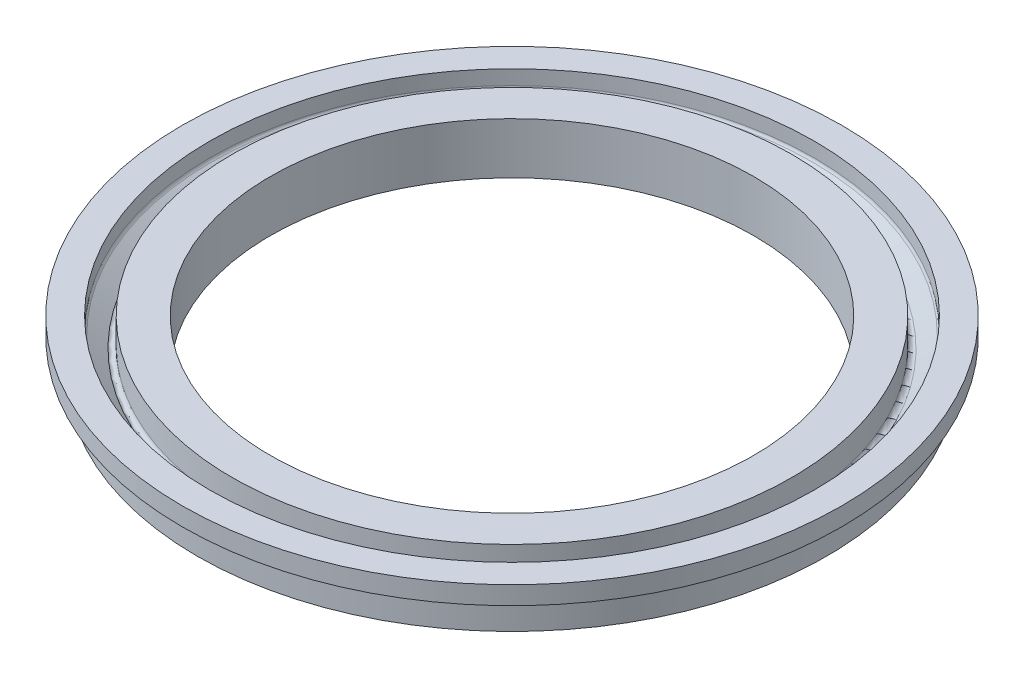
ISO-10303-21;
HEADER;
FILE_DESCRIPTION(('STEP AP214'),'2;1');
FILE_NAME('part.step','',(''),(''),'','','');
FILE_SCHEMA(('AUTOMOTIVE_DESIGN { 1 0 10303 214 1 1 1 1 }'));
ENDSEC;
DATA;
#1=APPLICATION_CONTEXT('core data for automotive mechanical design processes');
#2=APPLICATION_PROTOCOL_DEFINITION('international standard','automotive_design',2000,#1);
#3=PRODUCT_CONTEXT('',#1,'mechanical');
#4=PRODUCT('Part','Part','',(#3));
#5=PRODUCT_RELATED_PRODUCT_CATEGORY('part','',(#4));
#6=PRODUCT_DEFINITION_FORMATION('','',#4);
#7=PRODUCT_DEFINITION_CONTEXT('part definition',#1,'design');
#8=PRODUCT_DEFINITION('design','',#6,#7);
#9=PRODUCT_DEFINITION_SHAPE('','',#8);
#10=(LENGTH_UNIT() NAMED_UNIT(*) SI_UNIT(.MILLI.,.METRE.));
#11=(NAMED_UNIT(*) PLANE_ANGLE_UNIT() SI_UNIT($,.RADIAN.));
#12=(NAMED_UNIT(*) SI_UNIT($,.STERADIAN.) SOLID_ANGLE_UNIT());
#13=UNCERTAINTY_MEASURE_WITH_UNIT(LENGTH_MEASURE(1.E-05),#10,'distance_accuracy_value','');
#14=(GEOMETRIC_REPRESENTATION_CONTEXT(3) GLOBAL_UNCERTAINTY_ASSIGNED_CONTEXT((#13)) GLOBAL_UNIT_ASSIGNED_CONTEXT((#10,
#11,#12)) REPRESENTATION_CONTEXT('',''));
#15=CARTESIAN_POINT('',(0.,0.,0.));
#16=DIRECTION('',(0.,0.,1.));
#17=DIRECTION('',(1.,0.,0.));
#18=AXIS2_PLACEMENT_3D('',#15,#16,#17);
#19=CARTESIAN_POINT('',(0.,2.32755410959543,0.));
#20=DIRECTION('',(0.,1.,0.));
#21=DIRECTION('',(0.,0.,1.));
#22=AXIS2_PLACEMENT_3D('',#19,#20,#21);
#23=CONICAL_SURFACE('',#22,22.5091155851312,1.16820783945838);
#24=CARTESIAN_POINT('',(0.,1.95870686744885,0.));
#25=DIRECTION('',(0.,1.,0.));
#26=DIRECTION('',(0.,0.,1.));
#27=AXIS2_PLACEMENT_3D('',#24,#25,#26);
#28=CIRCLE('',#27,21.6429674493791);
#29=CARTESIAN_POINT('',(0.,1.95870686744885,21.6429674493791));
#30=VERTEX_POINT('',#29);
#31=EDGE_CURVE('E48',#30,#30,#28,.T.);
#32=ORIENTED_EDGE('',*,*,#31,.T.);
#33=EDGE_LOOP('',(#32));
#34=FACE_BOUND('',#33,.T.);
#35=CARTESIAN_POINT('',(0.,2.32755410959543,0.));
#36=DIRECTION('',(0.,-1.,0.));
#37=DIRECTION('',(0.,0.,-1.));
#38=AXIS2_PLACEMENT_3D('',#35,#36,#37);
#39=CIRCLE('',#38,22.5091155851312);
#40=CARTESIAN_POINT('',(0.,2.32755410959543,-22.5091155851312));
#41=VERTEX_POINT('',#40);
#42=EDGE_CURVE('E67',#41,#41,#39,.T.);
#43=ORIENTED_EDGE('',*,*,#42,.T.);
#44=EDGE_LOOP('',(#43));
#45=FACE_BOUND('',#44,.T.);
#46=ADVANCED_FACE('F41',(#34,#45),#23,.T.);
#47=CARTESIAN_POINT('',(0.,-2.52963758357563,0.));
#48=DIRECTION('',(0.,-1.,0.));
#49=DIRECTION('',(0.,0.,-1.));
#50=AXIS2_PLACEMENT_3D('',#47,#48,#49);
#51=CYLINDRICAL_SURFACE('',#50,22.5091155851312);
#52=ORIENTED_EDGE('',*,*,#42,.F.);
#53=EDGE_LOOP('',(#52));
#54=FACE_BOUND('',#53,.T.);
#55=CARTESIAN_POINT('',(0.,3.56865088334981,0.));
#56=DIRECTION('',(0.,-1.,0.));
#57=DIRECTION('',(0.,0.,-1.));
#58=AXIS2_PLACEMENT_3D('',#55,#56,#57);
#59=CIRCLE('',#58,22.5091155851312);
#60=CARTESIAN_POINT('',(0.,3.56865088334981,-22.5091155851312));
#61=VERTEX_POINT('',#60);
#62=EDGE_CURVE('E70',#61,#61,#59,.T.);
#63=ORIENTED_EDGE('',*,*,#62,.T.);
#64=EDGE_LOOP('',(#63));
#65=FACE_BOUND('',#64,.T.);
#66=ADVANCED_FACE('F107',(#54,#65),#51,.T.);
#67=CARTESIAN_POINT('',(-22.5091155851312,3.56865088334981,0.));
#68=DIRECTION('',(0.,-1.,0.));
#69=DIRECTION('',(0.,0.,-1.));
#70=AXIS2_PLACEMENT_3D('',#67,#68,#69);
#71=PLANE('',#70);
#72=ORIENTED_EDGE('',*,*,#62,.F.);
#73=EDGE_LOOP('',(#72));
#74=FACE_BOUND('',#73,.T.);
#75=CARTESIAN_POINT('',(0.,3.56865088334981,0.));
#76=DIRECTION('',(0.,-1.,0.));
#77=DIRECTION('',(0.,0.,-1.));
#78=AXIS2_PLACEMENT_3D('',#75,#76,#77);
#79=CIRCLE('',#78,20.6363588468084);
#80=CARTESIAN_POINT('',(0.,3.56865088334981,-20.6363588468084));
#81=VERTEX_POINT('',#80);
#82=EDGE_CURVE('E73',#81,#81,#79,.T.);
#83=ORIENTED_EDGE('',*,*,#82,.T.);
#84=EDGE_LOOP('',(#83));
#85=FACE_BOUND('',#84,.T.);
#86=ADVANCED_FACE('F112',(#74,#85),#71,.F.);
#87=CARTESIAN_POINT('',(0.,-2.52963758357563,0.));
#88=DIRECTION('',(0.,-1.,0.));
#89=DIRECTION('',(0.,0.,-1.));
#90=AXIS2_PLACEMENT_3D('',#87,#88,#89);
#91=CYLINDRICAL_SURFACE('',#90,20.6363588468084);
#92=CARTESIAN_POINT('',(0.,2.57154237516115,0.));
#93=DIRECTION('',(0.,-1.,0.));
#94=DIRECTION('',(0.,0.,-1.));
#95=AXIS2_PLACEMENT_3D('',#92,#93,#94);
#96=CIRCLE('',#95,20.6363588468084);
#97=CARTESIAN_POINT('',(0.,2.57154237516115,-20.6363588468084));
#98=VERTEX_POINT('',#97);
#99=EDGE_CURVE('E64',#98,#98,#96,.T.);
#100=ORIENTED_EDGE('',*,*,#99,.T.);
#101=EDGE_LOOP('',(#100));
#102=FACE_BOUND('',#101,.T.);
#103=ORIENTED_EDGE('',*,*,#82,.F.);
#104=EDGE_LOOP('',(#103));
#105=FACE_BOUND('',#104,.T.);
#106=ADVANCED_FACE('F133',(#102,#105),#91,.F.);
#107=CARTESIAN_POINT('',(0.,1.33501636475599,0.));
#108=DIRECTION('',(0.,1.,0.));
#109=DIRECTION('',(0.,0.,1.));
#110=AXIS2_PLACEMENT_3D('',#107,#108,#109);
#111=CONICAL_SURFACE('',#110,19.1090620893412,0.942708255558537);
#112=CARTESIAN_POINT('',(0.,2.3692542667676,0.));
#113=DIRECTION('',(0.,1.,0.));
#114=DIRECTION('',(0.,0.,1.));
#115=AXIS2_PLACEMENT_3D('',#112,#113,#114);
#116=CIRCLE('',#115,20.5332585445703);
#117=CARTESIAN_POINT('',(0.,2.3692542667676,20.5332585445703));
#118=VERTEX_POINT('',#117);
#119=EDGE_CURVE('E56',#118,#118,#116,.T.);
#120=ORIENTED_EDGE('',*,*,#119,.T.);
#121=EDGE_LOOP('',(#120));
#122=FACE_BOUND('',#121,.T.);
#123=CARTESIAN_POINT('',(0.,1.6232411452736,0.));
#124=DIRECTION('',(0.,1.,0.));
#125=DIRECTION('',(0.,0.,1.));
#126=AXIS2_PLACEMENT_3D('',#123,#124,#125);
#127=CIRCLE('',#126,19.5059617871031);
#128=CARTESIAN_POINT('',(0.,1.6232411452736,19.5059617871031));
#129=VERTEX_POINT('',#128);
#130=EDGE_CURVE('E61',#129,#129,#127,.F.);
#131=ORIENTED_EDGE('',*,*,#130,.T.);
#132=EDGE_LOOP('',(#131));
#133=FACE_BOUND('',#132,.T.);
#134=ADVANCED_FACE('F130',(#122,#133),#111,.F.);
#135=CARTESIAN_POINT('',(0.,-2.52963758357563,0.));
#136=DIRECTION('',(0.,-1.,0.));
#137=DIRECTION('',(0.,0.,-1.));
#138=AXIS2_PLACEMENT_3D('',#135,#136,#137);
#139=CYLINDRICAL_SURFACE('',#138,19.1090620893412);
#140=CARTESIAN_POINT('',(0.,1.82552925366715,0.));
#141=DIRECTION('',(0.,-1.,0.));
#142=DIRECTION('',(0.,0.,-1.));
#143=AXIS2_PLACEMENT_3D('',#140,#141,#142);
#144=CIRCLE('',#143,19.1090620893412);
#145=CARTESIAN_POINT('',(0.,1.82552925366715,-19.1090620893412));
#146=VERTEX_POINT('',#145);
#147=EDGE_CURVE('E10',#146,#146,#144,.F.);
#148=ORIENTED_EDGE('',*,*,#147,.T.);
#149=EDGE_LOOP('',(#148));
#150=FACE_BOUND('',#149,.T.);
#151=CARTESIAN_POINT('',(0.,3.54547708451306,0.));
#152=DIRECTION('',(0.,-1.,0.));
#153=DIRECTION('',(0.,0.,-1.));
#154=AXIS2_PLACEMENT_3D('',#151,#152,#153);
#155=CIRCLE('',#154,19.1090620893412);
#156=CARTESIAN_POINT('',(0.,3.54547708451306,-19.1090620893412));
#157=VERTEX_POINT('',#156);
#158=EDGE_CURVE('E76',#157,#157,#155,.T.);
#159=ORIENTED_EDGE('',*,*,#158,.T.);
#160=EDGE_LOOP('',(#159));
#161=FACE_BOUND('',#160,.T.);
#162=ADVANCED_FACE('F132',(#150,#161),#139,.T.);
#163=CARTESIAN_POINT('',(-19.1090620893412,3.54547708451306,0.));
#164=DIRECTION('',(0.,-1.,0.));
#165=DIRECTION('',(0.,0.,-1.));
#166=AXIS2_PLACEMENT_3D('',#163,#164,#165);
#167=PLANE('',#166);
#168=ORIENTED_EDGE('',*,*,#158,.F.);
#169=EDGE_LOOP('',(#168));
#170=FACE_BOUND('',#169,.T.);
#171=CARTESIAN_POINT('',(0.,3.54547708451306,0.));
#172=DIRECTION('',(0.,-1.,0.));
#173=DIRECTION('',(0.,0.,-1.));
#174=AXIS2_PLACEMENT_3D('',#171,#172,#173);
#175=CIRCLE('',#174,16.5);
#176=CARTESIAN_POINT('',(0.,3.54547708451306,-16.5));
#177=VERTEX_POINT('',#176);
#178=EDGE_CURVE('E79',#177,#177,#175,.T.);
#179=ORIENTED_EDGE('',*,*,#178,.T.);
#180=EDGE_LOOP('',(#179));
#181=FACE_BOUND('',#180,.T.);
#182=ADVANCED_FACE('F140',(#170,#181),#167,.F.);
#183=CARTESIAN_POINT('',(0.,-2.52963758357563,0.));
#184=DIRECTION('',(0.,-1.,0.));
#185=DIRECTION('',(0.,0.,-1.));
#186=AXIS2_PLACEMENT_3D('',#183,#184,#185);
#187=CYLINDRICAL_SURFACE('',#186,16.5);
#188=ORIENTED_EDGE('',*,*,#178,.F.);
#189=EDGE_LOOP('',(#188));
#190=FACE_BOUND('',#189,.T.);
#191=CARTESIAN_POINT('',(0.,0.045477084513064,0.));
#192=DIRECTION('',(0.,-1.,0.));
#193=DIRECTION('',(0.,0.,-1.));
#194=AXIS2_PLACEMENT_3D('',#191,#192,#193);
#195=CIRCLE('',#194,16.5);
#196=CARTESIAN_POINT('',(0.,0.045477084513064,-16.5));
#197=VERTEX_POINT('',#196);
#198=EDGE_CURVE('E82',#197,#197,#195,.T.);
#199=ORIENTED_EDGE('',*,*,#198,.T.);
#200=EDGE_LOOP('',(#199));
#201=FACE_BOUND('',#200,.T.);
#202=ADVANCED_FACE('F103',(#190,#201),#187,.F.);
#203=CARTESIAN_POINT('',(0.,0.0829832835506066,0.));
#204=DIRECTION('',(0.,1.,0.));
#205=DIRECTION('',(0.,0.,1.));
#206=AXIS2_PLACEMENT_3D('',#203,#204,#205);
#207=CONICAL_SURFACE('',#206,21.4909177468198,1.56328157801969);
#208=ORIENTED_EDGE('',*,*,#198,.F.);
#209=EDGE_LOOP('',(#208));
#210=FACE_BOUND('',#209,.T.);
#211=CARTESIAN_POINT('',(0.,0.0829832835506066,0.));
#212=DIRECTION('',(0.,-1.,0.));
#213=DIRECTION('',(0.,0.,-1.));
#214=AXIS2_PLACEMENT_3D('',#211,#212,#213);
#215=CIRCLE('',#214,21.4909177468198);
#216=CARTESIAN_POINT('',(0.,0.0829832835506066,-21.4909177468198));
#217=VERTEX_POINT('',#216);
#218=EDGE_CURVE('E85',#217,#217,#215,.T.);
#219=ORIENTED_EDGE('',*,*,#218,.T.);
#220=EDGE_LOOP('',(#219));
#221=FACE_BOUND('',#220,.T.);
#222=ADVANCED_FACE('F89',(#210,#221),#207,.T.);
#223=CARTESIAN_POINT('',(0.,-2.52963758357563,0.));
#224=DIRECTION('',(0.,-1.,0.));
#225=DIRECTION('',(0.,0.,-1.));
#226=AXIS2_PLACEMENT_3D('',#223,#224,#225);
#227=CYLINDRICAL_SURFACE('',#226,21.4909177468198);
#228=CARTESIAN_POINT('',(0.,1.7286943911975,0.));
#229=DIRECTION('',(0.,-1.,0.));
#230=DIRECTION('',(0.,0.,-1.));
#231=AXIS2_PLACEMENT_3D('',#228,#229,#230);
#232=CIRCLE('',#231,21.4909177468198);
#233=CARTESIAN_POINT('',(0.,1.7286943911975,-21.4909177468198));
#234=VERTEX_POINT('',#233);
#235=EDGE_CURVE('E52',#234,#234,#232,.T.);
#236=ORIENTED_EDGE('',*,*,#235,.T.);
#237=EDGE_LOOP('',(#236));
#238=FACE_BOUND('',#237,.T.);
#239=ORIENTED_EDGE('',*,*,#218,.F.);
#240=EDGE_LOOP('',(#239));
#241=FACE_BOUND('',#240,.T.);
#242=ADVANCED_FACE('F91',(#238,#241),#227,.T.);
#243=CARTESIAN_POINT('',(0.,2.57154237516115,0.));
#244=DIRECTION('',(0.,-1.,0.));
#245=DIRECTION('',(0.,0.,-1.));
#246=AXIS2_PLACEMENT_3D('',#243,#244,#245);
#247=TOROIDAL_SURFACE('',#246,20.3863588468084,0.25);
#248=ORIENTED_EDGE('',*,*,#119,.F.);
#249=EDGE_LOOP('',(#248));
#250=FACE_BOUND('',#249,.T.);
#251=ORIENTED_EDGE('',*,*,#99,.F.);
#252=EDGE_LOOP('',(#251));
#253=FACE_BOUND('',#252,.T.);
#254=ADVANCED_FACE('F93',(#250,#253),#247,.F.);
#255=CARTESIAN_POINT('',(0.,1.7286943911975,0.));
#256=DIRECTION('',(0.,-1.,0.));
#257=DIRECTION('',(0.,0.,-1.));
#258=AXIS2_PLACEMENT_3D('',#255,#256,#257);
#259=TOROIDAL_SURFACE('',#258,21.7409177468198,0.25);
#260=ORIENTED_EDGE('',*,*,#31,.F.);
#261=EDGE_LOOP('',(#260));
#262=FACE_BOUND('',#261,.T.);
#263=ORIENTED_EDGE('',*,*,#235,.F.);
#264=EDGE_LOOP('',(#263));
#265=FACE_BOUND('',#264,.T.);
#266=ADVANCED_FACE('F100',(#262,#265),#259,.F.);
#267=CARTESIAN_POINT('',(0.,1.82552925366715,0.));
#268=DIRECTION('',(0.,-1.,0.));
#269=DIRECTION('',(0.,0.,-1.));
#270=AXIS2_PLACEMENT_3D('',#267,#268,#269);
#271=TOROIDAL_SURFACE('',#270,19.3590620893412,0.25);
#272=ORIENTED_EDGE('',*,*,#147,.F.);
#273=EDGE_LOOP('',(#272));
#274=FACE_BOUND('',#273,.T.);
#275=ORIENTED_EDGE('',*,*,#130,.F.);
#276=EDGE_LOOP('',(#275));
#277=FACE_BOUND('',#276,.T.);
#278=ADVANCED_FACE('F43',(#274,#277),#271,.F.);
#279=CLOSED_SHELL('',(#46,#66,#86,#106,#134,#162,#182,#202,#222,#242,#254,#266,#278));
#280=MANIFOLD_SOLID_BREP('B2',#279);
#281=ADVANCED_BREP_SHAPE_REPRESENTATION('',(#18,#280),#14);
#282=SHAPE_DEFINITION_REPRESENTATION(#9,#281);
ENDSEC;
END-ISO-10303-21;
